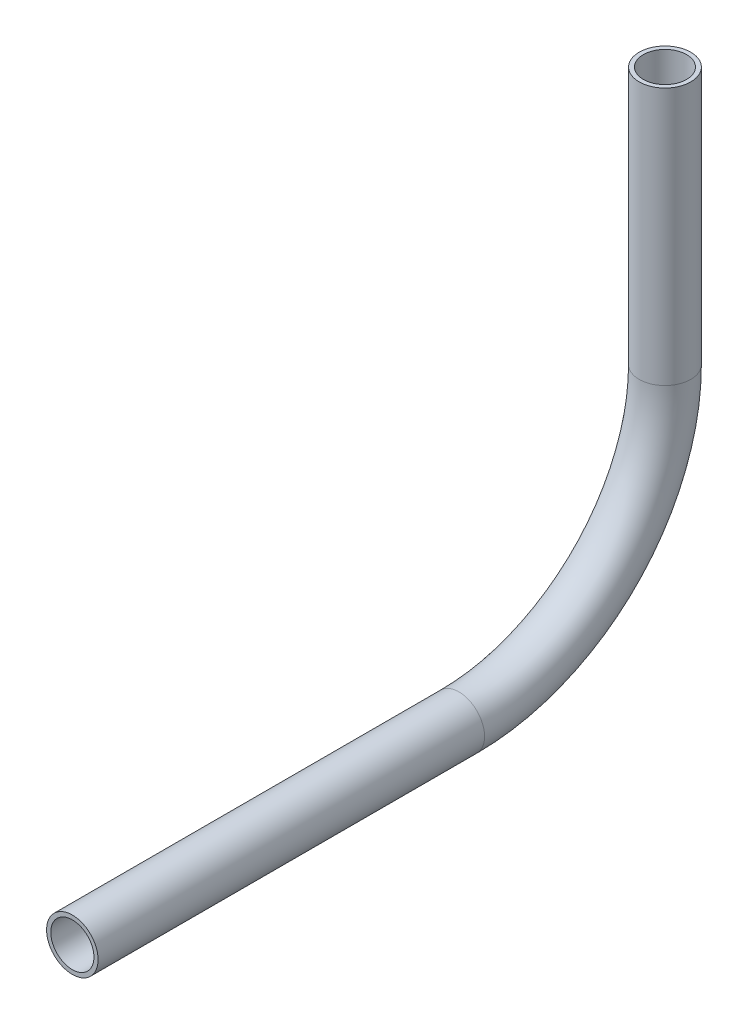
ISO-10303-21;
HEADER;
FILE_DESCRIPTION(('STEP AP214'),'2;1');
FILE_NAME('part.step','',(''),(''),'','','');
FILE_SCHEMA(('AUTOMOTIVE_DESIGN { 1 0 10303 214 1 1 1 1 }'));
ENDSEC;
DATA;
#1=APPLICATION_CONTEXT('core data for automotive mechanical design processes');
#2=APPLICATION_PROTOCOL_DEFINITION('international standard','automotive_design',2000,#1);
#3=PRODUCT_CONTEXT('',#1,'mechanical');
#4=PRODUCT('Part','Part','',(#3));
#5=PRODUCT_RELATED_PRODUCT_CATEGORY('part','',(#4));
#6=PRODUCT_DEFINITION_FORMATION('','',#4);
#7=PRODUCT_DEFINITION_CONTEXT('part definition',#1,'design');
#8=PRODUCT_DEFINITION('design','',#6,#7);
#9=PRODUCT_DEFINITION_SHAPE('','',#8);
#10=(LENGTH_UNIT() NAMED_UNIT(*) SI_UNIT(.MILLI.,.METRE.));
#11=(NAMED_UNIT(*) PLANE_ANGLE_UNIT() SI_UNIT($,.RADIAN.));
#12=(NAMED_UNIT(*) SI_UNIT($,.STERADIAN.) SOLID_ANGLE_UNIT());
#13=UNCERTAINTY_MEASURE_WITH_UNIT(LENGTH_MEASURE(1.E-05),#10,'distance_accuracy_value','');
#14=(GEOMETRIC_REPRESENTATION_CONTEXT(3) GLOBAL_UNCERTAINTY_ASSIGNED_CONTEXT((#13)) GLOBAL_UNIT_ASSIGNED_CONTEXT((#10,
#11,#12)) REPRESENTATION_CONTEXT('',''));
#15=CARTESIAN_POINT('',(0.,0.,0.));
#16=DIRECTION('',(0.,0.,1.));
#17=DIRECTION('',(1.,0.,0.));
#18=AXIS2_PLACEMENT_3D('',#15,#16,#17);
#19=CARTESIAN_POINT('',(0.,72.,-92.));
#20=DIRECTION('',(0.,-1.,0.));
#21=DIRECTION('',(1.,0.,0.));
#22=AXIS2_PLACEMENT_3D('',#19,#20,#21);
#23=PLANE('',#22);
#24=CARTESIAN_POINT('',(0.,72.,-92.));
#25=DIRECTION('',(0.,-1.,0.));
#26=DIRECTION('',(0.,0.,-1.));
#27=AXIS2_PLACEMENT_3D('',#24,#25,#26);
#28=CIRCLE('',#27,3.35);
#29=CARTESIAN_POINT('',(0.,72.,-95.35));
#30=VERTEX_POINT('',#29);
#31=EDGE_CURVE('E62',#30,#30,#28,.F.);
#32=ORIENTED_EDGE('',*,*,#31,.F.);
#33=EDGE_LOOP('',(#32));
#34=FACE_BOUND('',#33,.T.);
#35=CARTESIAN_POINT('',(0.,72.,-92.));
#36=DIRECTION('',(0.,-1.,0.));
#37=DIRECTION('',(1.,0.,0.));
#38=AXIS2_PLACEMENT_3D('',#35,#36,#37);
#39=CIRCLE('',#38,4.);
#40=CARTESIAN_POINT('',(4.,72.,-92.));
#41=VERTEX_POINT('',#40);
#42=EDGE_CURVE('E56',#41,#41,#39,.T.);
#43=ORIENTED_EDGE('',*,*,#42,.F.);
#44=EDGE_LOOP('',(#43));
#45=FACE_BOUND('',#44,.T.);
#46=ADVANCED_FACE('F36',(#34,#45),#23,.F.);
#47=CARTESIAN_POINT('',(0.,0.,0.));
#48=DIRECTION('',(0.,0.,1.));
#49=DIRECTION('',(1.,0.,0.));
#50=AXIS2_PLACEMENT_3D('',#47,#48,#49);
#51=PLANE('',#50);
#52=CARTESIAN_POINT('',(0.,0.,0.));
#53=DIRECTION('',(0.,0.,1.));
#54=DIRECTION('',(1.,0.,0.));
#55=AXIS2_PLACEMENT_3D('',#52,#53,#54);
#56=CIRCLE('',#55,3.35);
#57=CARTESIAN_POINT('',(3.35,0.,0.));
#58=VERTEX_POINT('',#57);
#59=EDGE_CURVE('E66',#58,#58,#56,.F.);
#60=ORIENTED_EDGE('',*,*,#59,.T.);
#61=EDGE_LOOP('',(#60));
#62=FACE_BOUND('',#61,.T.);
#63=CARTESIAN_POINT('',(0.,0.,0.));
#64=DIRECTION('',(0.,0.,1.));
#65=DIRECTION('',(1.,0.,0.));
#66=AXIS2_PLACEMENT_3D('',#63,#64,#65);
#67=CIRCLE('',#66,4.);
#68=CARTESIAN_POINT('',(4.,0.,0.));
#69=VERTEX_POINT('',#68);
#70=EDGE_CURVE('E10',#69,#69,#67,.T.);
#71=ORIENTED_EDGE('',*,*,#70,.T.);
#72=EDGE_LOOP('',(#71));
#73=FACE_BOUND('',#72,.T.);
#74=ADVANCED_FACE('F87',(#62,#73),#51,.T.);
#75=CARTESIAN_POINT('',(0.,72.,-92.));
#76=DIRECTION('',(0.,-1.,0.));
#77=DIRECTION('',(0.,0.,-1.));
#78=AXIS2_PLACEMENT_3D('',#75,#76,#77);
#79=CYLINDRICAL_SURFACE('',#78,4.);
#80=CARTESIAN_POINT('',(0.,32.,-92.));
#81=DIRECTION('',(0.,-1.,0.));
#82=DIRECTION('',(1.,0.,0.));
#83=AXIS2_PLACEMENT_3D('',#80,#81,#82);
#84=CIRCLE('',#83,4.);
#85=CARTESIAN_POINT('',(0.,32.,-96.));
#86=VERTEX_POINT('',#85);
#87=EDGE_CURVE('E50',#86,#86,#84,.T.);
#88=ORIENTED_EDGE('',*,*,#87,.F.);
#89=EDGE_LOOP('',(#88));
#90=FACE_BOUND('',#89,.T.);
#91=ORIENTED_EDGE('',*,*,#42,.T.);
#92=EDGE_LOOP('',(#91));
#93=FACE_BOUND('',#92,.T.);
#94=ADVANCED_FACE('F89',(#90,#93),#79,.T.);
#95=CARTESIAN_POINT('',(0.,32.,-60.));
#96=DIRECTION('',(-1.,0.,0.));
#97=DIRECTION('',(0.,0.,1.));
#98=AXIS2_PLACEMENT_3D('',#95,#96,#97);
#99=TOROIDAL_SURFACE('',#98,32.,4.);
#100=CARTESIAN_POINT('',(0.,0.,-60.));
#101=DIRECTION('',(0.,0.,1.));
#102=DIRECTION('',(1.,0.,0.));
#103=AXIS2_PLACEMENT_3D('',#100,#101,#102);
#104=CIRCLE('',#103,4.);
#105=CARTESIAN_POINT('',(0.,-4.,-60.));
#106=VERTEX_POINT('',#105);
#107=EDGE_CURVE('E43',#106,#106,#104,.T.);
#108=CARTESIAN_POINT('',(0.,32.,-60.));
#109=DIRECTION('',(-1.,0.,0.));
#110=DIRECTION('',(0.,0.,1.));
#111=AXIS2_PLACEMENT_3D('',#108,#109,#110);
#112=CIRCLE('',#111,36.);
#113=EDGE_CURVE('',#86,#106,#112,.T.);
#114=ORIENTED_EDGE('',*,*,#87,.T.);
#115=ORIENTED_EDGE('',*,*,#107,.F.);
#116=ORIENTED_EDGE('',*,*,#113,.T.);
#117=ORIENTED_EDGE('',*,*,#113,.F.);
#118=EDGE_LOOP('',(#114,#116,#115,#117));
#119=FACE_BOUND('',#118,.T.);
#120=ADVANCED_FACE('F94',(#119),#99,.T.);
#121=CARTESIAN_POINT('',(0.,0.,-60.));
#122=DIRECTION('',(0.,0.,1.));
#123=DIRECTION('',(1.,0.,0.));
#124=AXIS2_PLACEMENT_3D('',#121,#122,#123);
#125=CYLINDRICAL_SURFACE('',#124,4.);
#126=ORIENTED_EDGE('',*,*,#70,.F.);
#127=EDGE_LOOP('',(#126));
#128=FACE_BOUND('',#127,.T.);
#129=ORIENTED_EDGE('',*,*,#107,.T.);
#130=EDGE_LOOP('',(#129));
#131=FACE_BOUND('',#130,.T.);
#132=ADVANCED_FACE('F83',(#128,#131),#125,.T.);
#133=CARTESIAN_POINT('',(0.,0.,-60.));
#134=DIRECTION('',(0.,0.,1.));
#135=DIRECTION('',(1.,0.,0.));
#136=AXIS2_PLACEMENT_3D('',#133,#134,#135);
#137=CYLINDRICAL_SURFACE('',#136,3.35);
#138=CARTESIAN_POINT('',(0.,0.,-60.));
#139=DIRECTION('',(0.,0.,1.));
#140=DIRECTION('',(1.,0.,0.));
#141=AXIS2_PLACEMENT_3D('',#138,#139,#140);
#142=CIRCLE('',#141,3.35);
#143=CARTESIAN_POINT('',(0.,-3.35,-60.));
#144=VERTEX_POINT('',#143);
#145=EDGE_CURVE('E69',#144,#144,#142,.T.);
#146=ORIENTED_EDGE('',*,*,#145,.F.);
#147=EDGE_LOOP('',(#146));
#148=FACE_BOUND('',#147,.T.);
#149=ORIENTED_EDGE('',*,*,#59,.F.);
#150=EDGE_LOOP('',(#149));
#151=FACE_BOUND('',#150,.T.);
#152=ADVANCED_FACE('F79',(#148,#151),#137,.F.);
#153=CARTESIAN_POINT('',(0.,73.,-92.));
#154=DIRECTION('',(0.,-1.,0.));
#155=DIRECTION('',(0.,0.,-1.));
#156=AXIS2_PLACEMENT_3D('',#153,#154,#155);
#157=CYLINDRICAL_SURFACE('',#156,3.35);
#158=ORIENTED_EDGE('',*,*,#31,.T.);
#159=EDGE_LOOP('',(#158));
#160=FACE_BOUND('',#159,.T.);
#161=CARTESIAN_POINT('',(0.,32.,-92.));
#162=DIRECTION('',(0.,-1.,0.));
#163=DIRECTION('',(1.,0.,0.));
#164=AXIS2_PLACEMENT_3D('',#161,#162,#163);
#165=CIRCLE('',#164,3.35);
#166=CARTESIAN_POINT('',(0.,32.,-95.35));
#167=VERTEX_POINT('',#166);
#168=EDGE_CURVE('E65',#167,#167,#165,.T.);
#169=ORIENTED_EDGE('',*,*,#168,.T.);
#170=EDGE_LOOP('',(#169));
#171=FACE_BOUND('',#170,.T.);
#172=ADVANCED_FACE('F82',(#160,#171),#157,.F.);
#173=CARTESIAN_POINT('',(0.,32.,-60.));
#174=DIRECTION('',(-1.,0.,0.));
#175=DIRECTION('',(0.,0.,1.));
#176=AXIS2_PLACEMENT_3D('',#173,#174,#175);
#177=TOROIDAL_SURFACE('',#176,32.,3.35);
#178=CARTESIAN_POINT('',(0.,32.,-60.));
#179=DIRECTION('',(-1.,0.,0.));
#180=DIRECTION('',(0.,0.,1.));
#181=AXIS2_PLACEMENT_3D('',#178,#179,#180);
#182=CIRCLE('',#181,35.35);
#183=EDGE_CURVE('',#167,#144,#182,.T.);
#184=ORIENTED_EDGE('',*,*,#168,.F.);
#185=ORIENTED_EDGE('',*,*,#145,.T.);
#186=ORIENTED_EDGE('',*,*,#183,.T.);
#187=ORIENTED_EDGE('',*,*,#183,.F.);
#188=EDGE_LOOP('',(#184,#186,#185,#187));
#189=FACE_BOUND('',#188,.T.);
#190=ADVANCED_FACE('F76',(#189),#177,.F.);
#191=CLOSED_SHELL('',(#46,#74,#94,#120,#132,#152,#172,#190));
#192=MANIFOLD_SOLID_BREP('B2',#191);
#193=ADVANCED_BREP_SHAPE_REPRESENTATION('',(#18,#192),#14);
#194=SHAPE_DEFINITION_REPRESENTATION(#9,#193);
ENDSEC;
END-ISO-10303-21;
